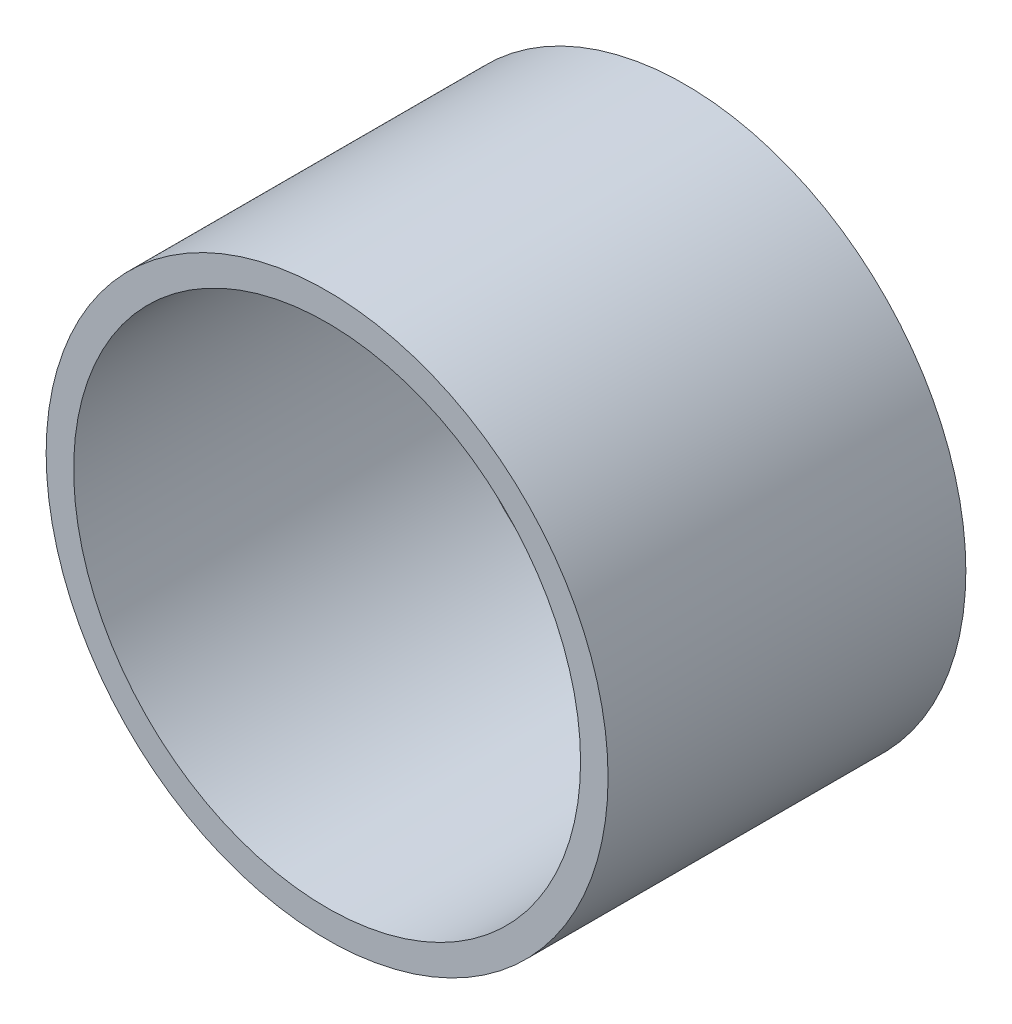
ISO-10303-21;
HEADER;
FILE_DESCRIPTION(('STEP AP214'),'2;1');
FILE_NAME('part.step','',(''),(''),'','','');
FILE_SCHEMA(('AUTOMOTIVE_DESIGN { 1 0 10303 214 1 1 1 1 }'));
ENDSEC;
DATA;
#1=APPLICATION_CONTEXT('core data for automotive mechanical design processes');
#2=APPLICATION_PROTOCOL_DEFINITION('international standard','automotive_design',2000,#1);
#3=PRODUCT_CONTEXT('',#1,'mechanical');
#4=PRODUCT('Part','Part','',(#3));
#5=PRODUCT_RELATED_PRODUCT_CATEGORY('part','',(#4));
#6=PRODUCT_DEFINITION_FORMATION('','',#4);
#7=PRODUCT_DEFINITION_CONTEXT('part definition',#1,'design');
#8=PRODUCT_DEFINITION('design','',#6,#7);
#9=PRODUCT_DEFINITION_SHAPE('','',#8);
#10=(LENGTH_UNIT() NAMED_UNIT(*) SI_UNIT(.MILLI.,.METRE.));
#11=(NAMED_UNIT(*) PLANE_ANGLE_UNIT() SI_UNIT($,.RADIAN.));
#12=(NAMED_UNIT(*) SI_UNIT($,.STERADIAN.) SOLID_ANGLE_UNIT());
#13=UNCERTAINTY_MEASURE_WITH_UNIT(LENGTH_MEASURE(1.E-05),#10,'distance_accuracy_value','');
#14=(GEOMETRIC_REPRESENTATION_CONTEXT(3) GLOBAL_UNCERTAINTY_ASSIGNED_CONTEXT((#13)) GLOBAL_UNIT_ASSIGNED_CONTEXT((#10,
#11,#12)) REPRESENTATION_CONTEXT('',''));
#15=CARTESIAN_POINT('',(0.,0.,0.));
#16=DIRECTION('',(0.,0.,1.));
#17=DIRECTION('',(1.,0.,0.));
#18=AXIS2_PLACEMENT_3D('',#15,#16,#17);
#19=CARTESIAN_POINT('',(0.,0.,7.76239969123703));
#20=DIRECTION('',(0.,0.,-1.));
#21=DIRECTION('',(-1.,0.,0.));
#22=AXIS2_PLACEMENT_3D('',#19,#20,#21);
#23=CYLINDRICAL_SURFACE('',#22,6.096);
#24=CARTESIAN_POINT('',(0.,0.,7.76239969123703));
#25=DIRECTION('',(0.,0.,1.));
#26=DIRECTION('',(1.,0.,0.));
#27=AXIS2_PLACEMENT_3D('',#24,#25,#26);
#28=CIRCLE('',#27,6.096);
#29=CARTESIAN_POINT('',(6.096,0.,7.76239969123703));
#30=VERTEX_POINT('',#29);
#31=EDGE_CURVE('E10',#30,#30,#28,.T.);
#32=ORIENTED_EDGE('',*,*,#31,.F.);
#33=EDGE_LOOP('',(#32));
#34=FACE_BOUND('',#33,.T.);
#35=CARTESIAN_POINT('',(0.,0.,0.));
#36=DIRECTION('',(0.,0.,1.));
#37=DIRECTION('',(1.,0.,0.));
#38=AXIS2_PLACEMENT_3D('',#35,#36,#37);
#39=CIRCLE('',#38,6.096);
#40=CARTESIAN_POINT('',(6.096,0.,0.));
#41=VERTEX_POINT('',#40);
#42=EDGE_CURVE('E42',#41,#41,#39,.T.);
#43=ORIENTED_EDGE('',*,*,#42,.T.);
#44=EDGE_LOOP('',(#43));
#45=FACE_BOUND('',#44,.T.);
#46=ADVANCED_FACE('F35',(#34,#45),#23,.T.);
#47=CARTESIAN_POINT('',(0.,0.,7.76239969123703));
#48=DIRECTION('',(0.,0.,1.));
#49=DIRECTION('',(1.,0.,0.));
#50=AXIS2_PLACEMENT_3D('',#47,#48,#49);
#51=PLANE('',#50);
#52=CARTESIAN_POINT('',(0.,0.,7.76239969123703));
#53=DIRECTION('',(0.,0.,1.));
#54=DIRECTION('',(1.,0.,0.));
#55=AXIS2_PLACEMENT_3D('',#52,#53,#54);
#56=CIRCLE('',#55,5.4991);
#57=CARTESIAN_POINT('',(5.4991,0.,7.76239969123703));
#58=VERTEX_POINT('',#57);
#59=EDGE_CURVE('E48',#58,#58,#56,.T.);
#60=ORIENTED_EDGE('',*,*,#59,.F.);
#61=EDGE_LOOP('',(#60));
#62=FACE_BOUND('',#61,.T.);
#63=ORIENTED_EDGE('',*,*,#31,.T.);
#64=EDGE_LOOP('',(#63));
#65=FACE_BOUND('',#64,.T.);
#66=ADVANCED_FACE('F64',(#62,#65),#51,.T.);
#67=CARTESIAN_POINT('',(0.,0.,0.));
#68=DIRECTION('',(0.,0.,1.));
#69=DIRECTION('',(1.,0.,0.));
#70=AXIS2_PLACEMENT_3D('',#67,#68,#69);
#71=PLANE('',#70);
#72=CARTESIAN_POINT('',(0.,0.,0.));
#73=DIRECTION('',(0.,0.,1.));
#74=DIRECTION('',(1.,0.,0.));
#75=AXIS2_PLACEMENT_3D('',#72,#73,#74);
#76=CIRCLE('',#75,5.4991);
#77=CARTESIAN_POINT('',(5.4991,0.,0.));
#78=VERTEX_POINT('',#77);
#79=EDGE_CURVE('E38',#78,#78,#76,.T.);
#80=ORIENTED_EDGE('',*,*,#79,.T.);
#81=EDGE_LOOP('',(#80));
#82=FACE_BOUND('',#81,.T.);
#83=ORIENTED_EDGE('',*,*,#42,.F.);
#84=EDGE_LOOP('',(#83));
#85=FACE_BOUND('',#84,.T.);
#86=ADVANCED_FACE('F55',(#82,#85),#71,.F.);
#87=CARTESIAN_POINT('',(0.,0.,-6.58361067264735));
#88=DIRECTION('',(0.,0.,1.));
#89=DIRECTION('',(1.,0.,0.));
#90=AXIS2_PLACEMENT_3D('',#87,#88,#89);
#91=CYLINDRICAL_SURFACE('',#90,5.4991);
#92=ORIENTED_EDGE('',*,*,#59,.T.);
#93=EDGE_LOOP('',(#92));
#94=FACE_BOUND('',#93,.T.);
#95=ORIENTED_EDGE('',*,*,#79,.F.);
#96=EDGE_LOOP('',(#95));
#97=FACE_BOUND('',#96,.T.);
#98=ADVANCED_FACE('F58',(#94,#97),#91,.F.);
#99=CLOSED_SHELL('',(#46,#66,#86,#98));
#100=MANIFOLD_SOLID_BREP('B2',#99);
#101=ADVANCED_BREP_SHAPE_REPRESENTATION('',(#18,#100),#14);
#102=SHAPE_DEFINITION_REPRESENTATION(#9,#101);
ENDSEC;
END-ISO-10303-21;
